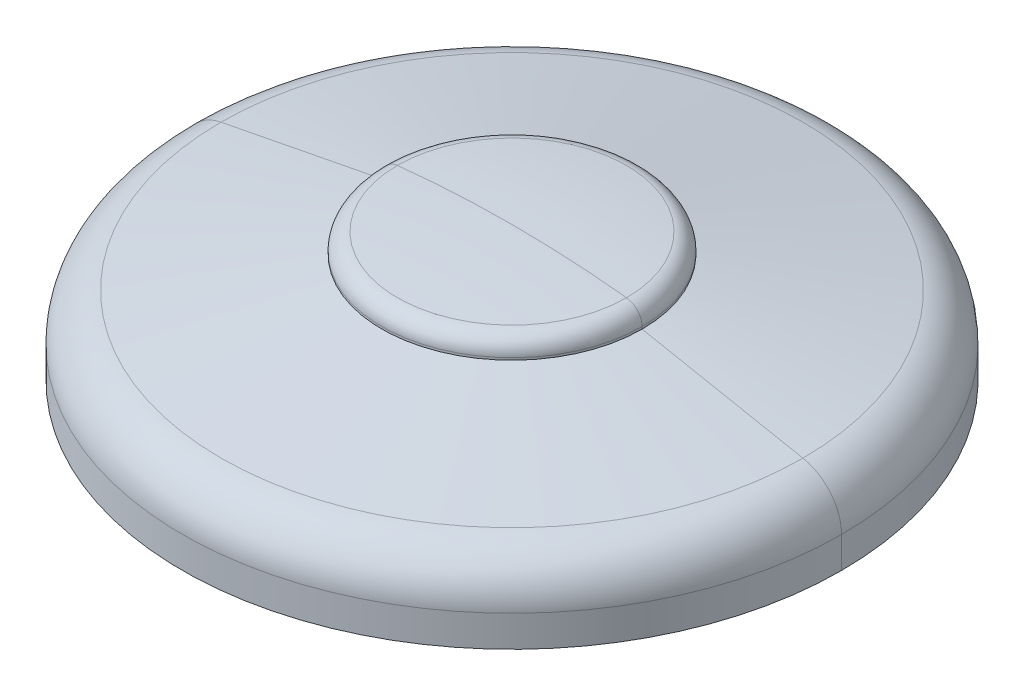
ISO-10303-21;
HEADER;
FILE_DESCRIPTION(('STEP AP214'),'2;1');
FILE_NAME('part.step','',(''),(''),'','','');
FILE_SCHEMA(('AUTOMOTIVE_DESIGN { 1 0 10303 214 1 1 1 1 }'));
ENDSEC;
DATA;
#1=APPLICATION_CONTEXT('core data for automotive mechanical design processes');
#2=APPLICATION_PROTOCOL_DEFINITION('international standard','automotive_design',2000,#1);
#3=PRODUCT_CONTEXT('',#1,'mechanical');
#4=PRODUCT('Part','Part','',(#3));
#5=PRODUCT_RELATED_PRODUCT_CATEGORY('part','',(#4));
#6=PRODUCT_DEFINITION_FORMATION('','',#4);
#7=PRODUCT_DEFINITION_CONTEXT('part definition',#1,'design');
#8=PRODUCT_DEFINITION('design','',#6,#7);
#9=PRODUCT_DEFINITION_SHAPE('','',#8);
#10=(LENGTH_UNIT() NAMED_UNIT(*) SI_UNIT(.MILLI.,.METRE.));
#11=(NAMED_UNIT(*) PLANE_ANGLE_UNIT() SI_UNIT($,.RADIAN.));
#12=(NAMED_UNIT(*) SI_UNIT($,.STERADIAN.) SOLID_ANGLE_UNIT());
#13=UNCERTAINTY_MEASURE_WITH_UNIT(LENGTH_MEASURE(1.E-05),#10,'distance_accuracy_value','');
#14=(GEOMETRIC_REPRESENTATION_CONTEXT(3) GLOBAL_UNCERTAINTY_ASSIGNED_CONTEXT((#13)) GLOBAL_UNIT_ASSIGNED_CONTEXT((#10,
#11,#12)) REPRESENTATION_CONTEXT('',''));
#15=CARTESIAN_POINT('',(0.,0.,0.));
#16=DIRECTION('',(0.,0.,1.));
#17=DIRECTION('',(1.,0.,0.));
#18=AXIS2_PLACEMENT_3D('',#15,#16,#17);
#19=CARTESIAN_POINT('',(0.,-12.31152654886,0.));
#20=DIRECTION('',(0.,1.,0.));
#21=DIRECTION('',(-1.,0.,0.));
#22=AXIS2_PLACEMENT_3D('',#19,#20,#21);
#23=SPHERICAL_SURFACE('',#22,12.40256771654);
#24=CARTESIAN_POINT('',(0.,-12.31152654886,0.));
#25=DIRECTION('',(0.,0.,1.));
#26=DIRECTION('',(0.,1.,0.));
#27=AXIS2_PLACEMENT_3D('',#24,#25,#26);
#28=CIRCLE('',#27,12.40256771654);
#29=CARTESIAN_POINT('',(0.,0.09104116767695,0.));
#30=VERTEX_POINT('',#29);
#31=CARTESIAN_POINT('',(-1.321306990958,0.02045763045722,0.));
#32=VERTEX_POINT('',#31);
#33=EDGE_CURVE('E27',#30,#32,#28,.T.);
#34=ORIENTED_EDGE('',*,*,#33,.T.);
#35=CARTESIAN_POINT('',(0.,0.02045763045722,0.));
#36=DIRECTION('',(0.,-1.,0.));
#37=DIRECTION('',(1.,0.,0.));
#38=AXIS2_PLACEMENT_3D('',#35,#36,#37);
#39=CIRCLE('',#38,1.321306990958);
#40=CARTESIAN_POINT('',(1.321306990958,0.02045763045722,0.));
#41=VERTEX_POINT('',#40);
#42=EDGE_CURVE('E147',#41,#32,#39,.T.);
#43=ORIENTED_EDGE('',*,*,#42,.F.);
#44=CARTESIAN_POINT('',(0.,-12.31152654886,0.));
#45=DIRECTION('',(0.,0.,-1.));
#46=DIRECTION('',(0.,1.,0.));
#47=AXIS2_PLACEMENT_3D('',#44,#45,#46);
#48=CIRCLE('',#47,12.40256771654);
#49=EDGE_CURVE('E11',#30,#41,#48,.T.);
#50=ORIENTED_EDGE('',*,*,#49,.F.);
#51=EDGE_LOOP('',(#34,#43,#50));
#52=FACE_BOUND('',#51,.T.);
#53=ADVANCED_FACE('F16',(#52),#23,.T.);
#54=CARTESIAN_POINT('',(0.,-12.31152654886,0.));
#55=DIRECTION('',(0.,1.,0.));
#56=DIRECTION('',(-1.,0.,0.));
#57=AXIS2_PLACEMENT_3D('',#54,#55,#56);
#58=SPHERICAL_SURFACE('',#57,12.40256771654);
#59=CARTESIAN_POINT('',(0.,0.02045763045722,0.));
#60=DIRECTION('',(0.,1.,0.));
#61=DIRECTION('',(1.,0.,0.));
#62=AXIS2_PLACEMENT_3D('',#59,#60,#61);
#63=CIRCLE('',#62,1.321306990958);
#64=EDGE_CURVE('E198',#41,#32,#63,.T.);
#65=ORIENTED_EDGE('',*,*,#64,.T.);
#66=ORIENTED_EDGE('',*,*,#33,.F.);
#67=ORIENTED_EDGE('',*,*,#49,.T.);
#68=EDGE_LOOP('',(#65,#66,#67));
#69=FACE_BOUND('',#68,.T.);
#70=ADVANCED_FACE('F323',(#69),#58,.T.);
#71=CARTESIAN_POINT('',(0.,-0.1784041610874,0.));
#72=DIRECTION('',(0.,1.,0.));
#73=DIRECTION('',(-1.,0.,0.));
#74=AXIS2_PLACEMENT_3D('',#71,#72,#73);
#75=TOROIDAL_SURFACE('',#74,1.3,0.2);
#76=CARTESIAN_POINT('',(0.,-0.1784041610874,0.));
#77=DIRECTION('',(0.,1.,0.));
#78=DIRECTION('',(1.,0.,0.));
#79=AXIS2_PLACEMENT_3D('',#76,#77,#78);
#80=CIRCLE('',#79,1.5);
#81=CARTESIAN_POINT('',(1.5,-0.1784041610874,0.));
#82=VERTEX_POINT('',#81);
#83=CARTESIAN_POINT('',(-1.5,-0.1784041610874,0.));
#84=VERTEX_POINT('',#83);
#85=EDGE_CURVE('E152',#82,#84,#80,.T.);
#86=ORIENTED_EDGE('',*,*,#85,.T.);
#87=CARTESIAN_POINT('',(-1.3,-0.1784041610874,0.));
#88=DIRECTION('',(0.,0.,1.));
#89=DIRECTION('',(-0.106534954789698,0.994308957722879,0.));
#90=AXIS2_PLACEMENT_3D('',#87,#88,#89);
#91=CIRCLE('',#90,0.2);
#92=EDGE_CURVE('E182',#32,#84,#91,.T.);
#93=ORIENTED_EDGE('',*,*,#92,.F.);
#94=ORIENTED_EDGE('',*,*,#64,.F.);
#95=CARTESIAN_POINT('',(1.3,-0.1784041610874,0.));
#96=DIRECTION('',(0.,0.,-1.));
#97=DIRECTION('',(0.106534954789698,0.994308957722879,0.));
#98=AXIS2_PLACEMENT_3D('',#95,#96,#97);
#99=CIRCLE('',#98,0.2);
#100=EDGE_CURVE('E186',#41,#82,#99,.T.);
#101=ORIENTED_EDGE('',*,*,#100,.T.);
#102=EDGE_LOOP('',(#86,#93,#94,#101));
#103=FACE_BOUND('',#102,.T.);
#104=ADVANCED_FACE('F328',(#103),#75,.T.);
#105=CARTESIAN_POINT('',(0.,-0.1784041610874,0.));
#106=DIRECTION('',(0.,1.,0.));
#107=DIRECTION('',(-1.,0.,0.));
#108=AXIS2_PLACEMENT_3D('',#105,#106,#107);
#109=TOROIDAL_SURFACE('',#108,1.3,0.2);
#110=ORIENTED_EDGE('',*,*,#42,.T.);
#111=ORIENTED_EDGE('',*,*,#92,.T.);
#112=CARTESIAN_POINT('',(0.,-0.1784041610874,0.));
#113=DIRECTION('',(0.,-1.,0.));
#114=DIRECTION('',(1.,0.,0.));
#115=AXIS2_PLACEMENT_3D('',#112,#113,#114);
#116=CIRCLE('',#115,1.5);
#117=EDGE_CURVE('E143',#82,#84,#116,.T.);
#118=ORIENTED_EDGE('',*,*,#117,.F.);
#119=ORIENTED_EDGE('',*,*,#100,.F.);
#120=EDGE_LOOP('',(#110,#111,#118,#119));
#121=FACE_BOUND('',#120,.T.);
#122=ADVANCED_FACE('F391',(#121),#109,.T.);
#123=CARTESIAN_POINT('',(0.,-1.541965273702,0.));
#124=DIRECTION('',(0.,1.,0.));
#125=DIRECTION('',(-1.,0.,0.));
#126=AXIS2_PLACEMENT_3D('',#123,#124,#125);
#127=CYLINDRICAL_SURFACE('',#126,1.5);
#128=ORIENTED_EDGE('',*,*,#117,.T.);
#129=DIRECTION('',(0.,-1.,0.));
#130=VECTOR('',#129,1.);
#131=CARTESIAN_POINT('',(-1.5,-0.1784041610874,0.));
#132=LINE('',#131,#130);
#133=CARTESIAN_POINT('',(-1.5,-0.203743338991,0.));
#134=VERTEX_POINT('',#133);
#135=EDGE_CURVE('E149',#84,#134,#132,.T.);
#136=ORIENTED_EDGE('',*,*,#135,.T.);
#137=CARTESIAN_POINT('',(0.,-0.203743338991,0.));
#138=DIRECTION('',(0.,-1.,0.));
#139=DIRECTION('',(1.,0.,0.));
#140=AXIS2_PLACEMENT_3D('',#137,#138,#139);
#141=CIRCLE('',#140,1.5);
#142=CARTESIAN_POINT('',(1.5,-0.203743338991,0.));
#143=VERTEX_POINT('',#142);
#144=EDGE_CURVE('E109',#143,#134,#141,.T.);
#145=ORIENTED_EDGE('',*,*,#144,.F.);
#146=DIRECTION('',(0.,-1.,0.));
#147=VECTOR('',#146,1.);
#148=CARTESIAN_POINT('',(1.5,-0.1784041610874,0.));
#149=LINE('',#148,#147);
#150=EDGE_CURVE('E148',#82,#143,#149,.T.);
#151=ORIENTED_EDGE('',*,*,#150,.F.);
#152=EDGE_LOOP('',(#128,#136,#145,#151));
#153=FACE_BOUND('',#152,.T.);
#154=ADVANCED_FACE('F298',(#153),#127,.T.);
#155=CARTESIAN_POINT('',(0.,-1.541965273702,0.));
#156=DIRECTION('',(0.,1.,0.));
#157=DIRECTION('',(-1.,0.,0.));
#158=AXIS2_PLACEMENT_3D('',#155,#156,#157);
#159=CYLINDRICAL_SURFACE('',#158,1.5);
#160=CARTESIAN_POINT('',(0.,-0.203743338991,0.));
#161=DIRECTION('',(0.,1.,0.));
#162=DIRECTION('',(1.,0.,0.));
#163=AXIS2_PLACEMENT_3D('',#160,#161,#162);
#164=CIRCLE('',#163,1.5);
#165=EDGE_CURVE('E20',#143,#134,#164,.T.);
#166=ORIENTED_EDGE('',*,*,#165,.T.);
#167=ORIENTED_EDGE('',*,*,#135,.F.);
#168=ORIENTED_EDGE('',*,*,#85,.F.);
#169=ORIENTED_EDGE('',*,*,#150,.T.);
#170=EDGE_LOOP('',(#166,#167,#168,#169));
#171=FACE_BOUND('',#170,.T.);
#172=ADVANCED_FACE('F292',(#171),#159,.T.);
#173=CARTESIAN_POINT('',(0.,-0.3840257251511,0.));
#174=DIRECTION('',(0.,-1.,0.));
#175=DIRECTION('',(1.,0.,0.));
#176=AXIS2_PLACEMENT_3D('',#173,#174,#175);
#177=CONICAL_SURFACE('',#176,2.427472473729,1.37881010907526);
#178=CARTESIAN_POINT('',(0.,-0.5643081113112,0.));
#179=DIRECTION('',(0.,1.,0.));
#180=DIRECTION('',(1.,0.,0.));
#181=AXIS2_PLACEMENT_3D('',#178,#179,#180);
#182=CIRCLE('',#181,3.354944947457);
#183=CARTESIAN_POINT('',(3.354944947457,-0.5643081113112,0.));
#184=VERTEX_POINT('',#183);
#185=CARTESIAN_POINT('',(-3.354944947457,-0.5643081113112,0.));
#186=VERTEX_POINT('',#185);
#187=EDGE_CURVE('E125',#184,#186,#182,.T.);
#188=ORIENTED_EDGE('',*,*,#187,.T.);
#189=DIRECTION('',(-0.981627183447674,-0.190808995376495,0.));
#190=VECTOR('',#189,1.);
#191=CARTESIAN_POINT('',(-1.5,-0.203743338991,0.));
#192=LINE('',#191,#190);
#193=EDGE_CURVE('E103',#134,#186,#192,.T.);
#194=ORIENTED_EDGE('',*,*,#193,.F.);
#195=ORIENTED_EDGE('',*,*,#165,.F.);
#196=DIRECTION('',(0.981627183447674,-0.190808995376495,0.));
#197=VECTOR('',#196,1.);
#198=CARTESIAN_POINT('',(1.5,-0.203743338991,0.));
#199=LINE('',#198,#197);
#200=EDGE_CURVE('E96',#143,#184,#199,.T.);
#201=ORIENTED_EDGE('',*,*,#200,.T.);
#202=EDGE_LOOP('',(#188,#194,#195,#201));
#203=FACE_BOUND('',#202,.T.);
#204=ADVANCED_FACE('F126',(#203),#177,.T.);
#205=CARTESIAN_POINT('',(0.,-0.3840257251511,0.));
#206=DIRECTION('',(0.,-1.,0.));
#207=DIRECTION('',(1.,0.,0.));
#208=AXIS2_PLACEMENT_3D('',#205,#206,#207);
#209=CONICAL_SURFACE('',#208,2.427472473729,1.37881010907526);
#210=ORIENTED_EDGE('',*,*,#144,.T.);
#211=ORIENTED_EDGE('',*,*,#193,.T.);
#212=CARTESIAN_POINT('',(0.,-0.5643081113112,0.));
#213=DIRECTION('',(0.,-1.,0.));
#214=DIRECTION('',(1.,0.,0.));
#215=AXIS2_PLACEMENT_3D('',#212,#213,#214);
#216=CIRCLE('',#215,3.354944947457);
#217=EDGE_CURVE('E106',#184,#186,#216,.T.);
#218=ORIENTED_EDGE('',*,*,#217,.F.);
#219=ORIENTED_EDGE('',*,*,#200,.F.);
#220=EDGE_LOOP('',(#210,#211,#218,#219));
#221=FACE_BOUND('',#220,.T.);
#222=ADVANCED_FACE('F105',(#221),#209,.T.);
#223=CARTESIAN_POINT('',(0.,-15.97488877998,0.));
#224=DIRECTION('',(0.,1.,0.));
#225=DIRECTION('',(-1.,0.,0.));
#226=AXIS2_PLACEMENT_3D('',#223,#224,#225);
#227=SPHERICAL_SURFACE('',#226,15.);
#228=CARTESIAN_POINT('',(0.,-1.464203062207,0.));
#229=DIRECTION('',(0.,-1.,0.));
#230=DIRECTION('',(1.,0.,0.));
#231=AXIS2_PLACEMENT_3D('',#228,#229,#230);
#232=CIRCLE('',#231,3.8);
#233=CARTESIAN_POINT('',(3.8,-1.464203062207,0.));
#234=VERTEX_POINT('',#233);
#235=CARTESIAN_POINT('',(-3.8,-1.464203062207,0.));
#236=VERTEX_POINT('',#235);
#237=EDGE_CURVE('E190',#234,#236,#232,.T.);
#238=ORIENTED_EDGE('',*,*,#237,.T.);
#239=CARTESIAN_POINT('',(0.,-15.97488877998,0.));
#240=DIRECTION('',(0.,0.,-1.));
#241=DIRECTION('',(-0.253333333333296,0.967379047851586,0.));
#242=AXIS2_PLACEMENT_3D('',#239,#240,#241);
#243=CIRCLE('',#242,15.);
#244=CARTESIAN_POINT('',(0.,-0.9748887799811,0.));
#245=VERTEX_POINT('',#244);
#246=EDGE_CURVE('E158',#236,#245,#243,.T.);
#247=ORIENTED_EDGE('',*,*,#246,.T.);
#248=CARTESIAN_POINT('',(0.,-15.97488877998,0.));
#249=DIRECTION('',(0.,0.,1.));
#250=DIRECTION('',(0.253333333333296,0.967379047851586,0.));
#251=AXIS2_PLACEMENT_3D('',#248,#249,#250);
#252=CIRCLE('',#251,15.);
#253=EDGE_CURVE('E75',#234,#245,#252,.T.);
#254=ORIENTED_EDGE('',*,*,#253,.F.);
#255=EDGE_LOOP('',(#238,#247,#254));
#256=FACE_BOUND('',#255,.T.);
#257=ADVANCED_FACE('F360',(#256),#227,.F.);
#258=CARTESIAN_POINT('',(0.,-15.97488877998,0.));
#259=DIRECTION('',(0.,1.,0.));
#260=DIRECTION('',(-1.,0.,0.));
#261=AXIS2_PLACEMENT_3D('',#258,#259,#260);
#262=SPHERICAL_SURFACE('',#261,15.);
#263=ORIENTED_EDGE('',*,*,#246,.F.);
#264=CARTESIAN_POINT('',(0.,-1.464203062207,0.));
#265=DIRECTION('',(0.,1.,0.));
#266=DIRECTION('',(1.,0.,0.));
#267=AXIS2_PLACEMENT_3D('',#264,#265,#266);
#268=CIRCLE('',#267,3.8);
#269=EDGE_CURVE('E155',#234,#236,#268,.T.);
#270=ORIENTED_EDGE('',*,*,#269,.F.);
#271=ORIENTED_EDGE('',*,*,#253,.T.);
#272=EDGE_LOOP('',(#263,#270,#271));
#273=FACE_BOUND('',#272,.T.);
#274=ADVANCED_FACE('F18',(#273),#262,.F.);
#275=CARTESIAN_POINT('',(0.,-1.541965273702,0.));
#276=DIRECTION('',(0.,1.,0.));
#277=DIRECTION('',(-1.,0.,0.));
#278=AXIS2_PLACEMENT_3D('',#275,#276,#277);
#279=CYLINDRICAL_SURFACE('',#278,3.8);
#280=ORIENTED_EDGE('',*,*,#269,.T.);
#281=DIRECTION('',(0.,-1.,0.));
#282=VECTOR('',#281,1.);
#283=CARTESIAN_POINT('',(-3.8,-1.104203062207,0.));
#284=LINE('',#283,#282);
#285=CARTESIAN_POINT('',(-3.8,-1.104203062207,0.));
#286=VERTEX_POINT('',#285);
#287=EDGE_CURVE('E191',#286,#236,#284,.T.);
#288=ORIENTED_EDGE('',*,*,#287,.F.);
#289=CARTESIAN_POINT('',(0.,-1.104203062207,0.));
#290=DIRECTION('',(0.,1.,0.));
#291=DIRECTION('',(1.,0.,0.));
#292=AXIS2_PLACEMENT_3D('',#289,#290,#291);
#293=CIRCLE('',#292,3.8);
#294=CARTESIAN_POINT('',(3.8,-1.104203062207,0.));
#295=VERTEX_POINT('',#294);
#296=EDGE_CURVE('E132',#295,#286,#293,.T.);
#297=ORIENTED_EDGE('',*,*,#296,.F.);
#298=DIRECTION('',(0.,-1.,0.));
#299=VECTOR('',#298,1.);
#300=CARTESIAN_POINT('',(3.8,-1.104203062207,0.));
#301=LINE('',#300,#299);
#302=EDGE_CURVE('E159',#295,#234,#301,.T.);
#303=ORIENTED_EDGE('',*,*,#302,.T.);
#304=EDGE_LOOP('',(#280,#288,#297,#303));
#305=FACE_BOUND('',#304,.T.);
#306=ADVANCED_FACE('F313',(#305),#279,.T.);
#307=CARTESIAN_POINT('',(0.,-1.541965273702,0.));
#308=DIRECTION('',(0.,1.,0.));
#309=DIRECTION('',(-1.,0.,0.));
#310=AXIS2_PLACEMENT_3D('',#307,#308,#309);
#311=CYLINDRICAL_SURFACE('',#310,3.8);
#312=CARTESIAN_POINT('',(0.,-1.104203062207,0.));
#313=DIRECTION('',(0.,-1.,0.));
#314=DIRECTION('',(1.,0.,0.));
#315=AXIS2_PLACEMENT_3D('',#312,#313,#314);
#316=CIRCLE('',#315,3.8);
#317=EDGE_CURVE('E123',#295,#286,#316,.T.);
#318=ORIENTED_EDGE('',*,*,#317,.T.);
#319=ORIENTED_EDGE('',*,*,#287,.T.);
#320=ORIENTED_EDGE('',*,*,#237,.F.);
#321=ORIENTED_EDGE('',*,*,#302,.F.);
#322=EDGE_LOOP('',(#318,#319,#320,#321));
#323=FACE_BOUND('',#322,.T.);
#324=ADVANCED_FACE('F308',(#323),#311,.T.);
#325=CARTESIAN_POINT('',(0.,-1.104203062207,0.));
#326=DIRECTION('',(0.,1.,0.));
#327=DIRECTION('',(-1.,0.,0.));
#328=AXIS2_PLACEMENT_3D('',#325,#326,#327);
#329=TOROIDAL_SURFACE('',#328,3.25,0.55);
#330=ORIENTED_EDGE('',*,*,#217,.T.);
#331=CARTESIAN_POINT('',(-3.25,-1.104203062207,0.));
#332=DIRECTION('',(0.,0.,1.));
#333=DIRECTION('',(-0.190808995376495,0.981627183447674,0.));
#334=AXIS2_PLACEMENT_3D('',#331,#332,#333);
#335=CIRCLE('',#334,0.55);
#336=EDGE_CURVE('E117',#186,#286,#335,.T.);
#337=ORIENTED_EDGE('',*,*,#336,.T.);
#338=ORIENTED_EDGE('',*,*,#317,.F.);
#339=CARTESIAN_POINT('',(3.25,-1.104203062207,0.));
#340=DIRECTION('',(0.,0.,-1.));
#341=DIRECTION('',(0.190808995376495,0.981627183447674,0.));
#342=AXIS2_PLACEMENT_3D('',#339,#340,#341);
#343=CIRCLE('',#342,0.55);
#344=EDGE_CURVE('E120',#184,#295,#343,.T.);
#345=ORIENTED_EDGE('',*,*,#344,.F.);
#346=EDGE_LOOP('',(#330,#337,#338,#345));
#347=FACE_BOUND('',#346,.T.);
#348=ADVANCED_FACE('F114',(#347),#329,.T.);
#349=CARTESIAN_POINT('',(0.,-1.104203062207,0.));
#350=DIRECTION('',(0.,1.,0.));
#351=DIRECTION('',(-1.,0.,0.));
#352=AXIS2_PLACEMENT_3D('',#349,#350,#351);
#353=TOROIDAL_SURFACE('',#352,3.25,0.55);
#354=ORIENTED_EDGE('',*,*,#296,.T.);
#355=ORIENTED_EDGE('',*,*,#336,.F.);
#356=ORIENTED_EDGE('',*,*,#187,.F.);
#357=ORIENTED_EDGE('',*,*,#344,.T.);
#358=EDGE_LOOP('',(#354,#355,#356,#357));
#359=FACE_BOUND('',#358,.T.);
#360=ADVANCED_FACE('F130',(#359),#353,.T.);
#361=CLOSED_SHELL('',(#53,#70,#104,#122,#154,#172,#204,#222,#257,#274,#306,#324,#348,#360));
#362=MANIFOLD_SOLID_BREP('B1',#361);
#363=ADVANCED_BREP_SHAPE_REPRESENTATION('',(#18,#362),#14);
#364=SHAPE_DEFINITION_REPRESENTATION(#9,#363);
ENDSEC;
END-ISO-10303-21;
